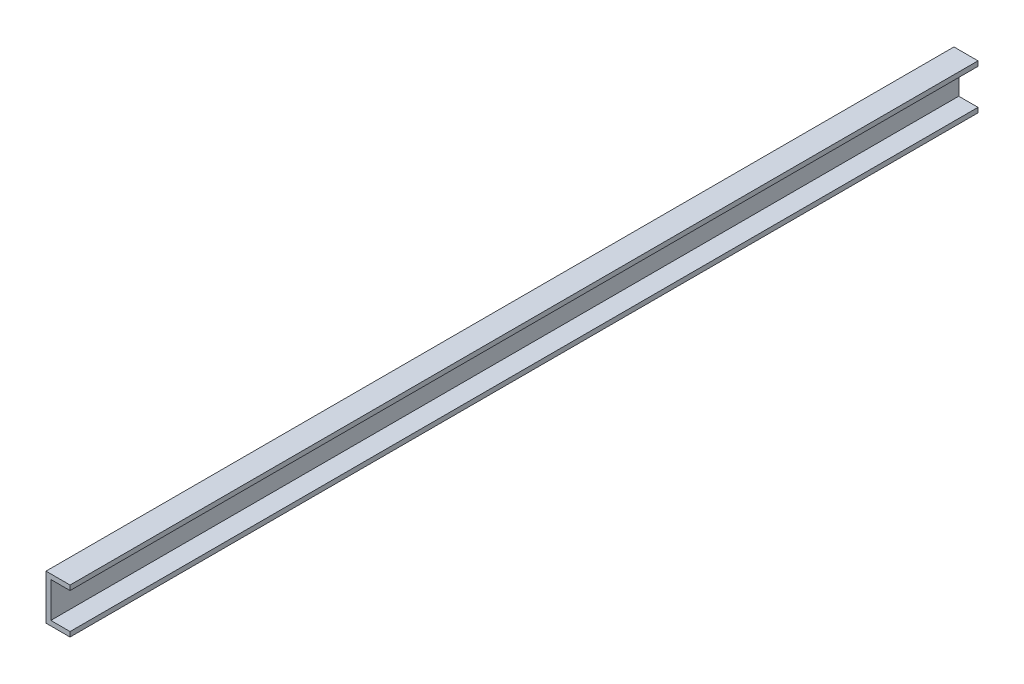
ISO-10303-21;
HEADER;
FILE_DESCRIPTION(('STEP AP214'),'2;1');
FILE_NAME('part.step','',(''),(''),'','','');
FILE_SCHEMA(('AUTOMOTIVE_DESIGN { 1 0 10303 214 1 1 1 1 }'));
ENDSEC;
DATA;
#1=APPLICATION_CONTEXT('core data for automotive mechanical design processes');
#2=APPLICATION_PROTOCOL_DEFINITION('international standard','automotive_design',2000,#1);
#3=PRODUCT_CONTEXT('',#1,'mechanical');
#4=PRODUCT('Part','Part','',(#3));
#5=PRODUCT_RELATED_PRODUCT_CATEGORY('part','',(#4));
#6=PRODUCT_DEFINITION_FORMATION('','',#4);
#7=PRODUCT_DEFINITION_CONTEXT('part definition',#1,'design');
#8=PRODUCT_DEFINITION('design','',#6,#7);
#9=PRODUCT_DEFINITION_SHAPE('','',#8);
#10=(LENGTH_UNIT() NAMED_UNIT(*) SI_UNIT(.MILLI.,.METRE.));
#11=(NAMED_UNIT(*) PLANE_ANGLE_UNIT() SI_UNIT($,.RADIAN.));
#12=(NAMED_UNIT(*) SI_UNIT($,.STERADIAN.) SOLID_ANGLE_UNIT());
#13=UNCERTAINTY_MEASURE_WITH_UNIT(LENGTH_MEASURE(1.E-05),#10,'distance_accuracy_value','');
#14=(GEOMETRIC_REPRESENTATION_CONTEXT(3) GLOBAL_UNCERTAINTY_ASSIGNED_CONTEXT((#13)) GLOBAL_UNIT_ASSIGNED_CONTEXT((#10,
#11,#12)) REPRESENTATION_CONTEXT('',''));
#15=CARTESIAN_POINT('',(0.,0.,0.));
#16=DIRECTION('',(0.,0.,1.));
#17=DIRECTION('',(1.,0.,0.));
#18=AXIS2_PLACEMENT_3D('',#15,#16,#17);
#19=CARTESIAN_POINT('',(40.,-37.5,-755.));
#20=DIRECTION('',(0.,1.,0.));
#21=DIRECTION('',(-1.,0.,0.));
#22=AXIS2_PLACEMENT_3D('',#19,#20,#21);
#23=PLANE('',#22);
#24=DIRECTION('',(-1.,0.,0.));
#25=VECTOR('',#24,1.);
#26=CARTESIAN_POINT('',(40.,-37.5,755.));
#27=LINE('',#26,#25);
#28=CARTESIAN_POINT('',(40.,-37.5,755.));
#29=VERTEX_POINT('',#28);
#30=CARTESIAN_POINT('',(0.,-37.5,755.));
#31=VERTEX_POINT('',#30);
#32=EDGE_CURVE('E164',#29,#31,#27,.T.);
#33=ORIENTED_EDGE('',*,*,#32,.T.);
#34=DIRECTION('',(0.,0.,1.));
#35=VECTOR('',#34,1.);
#36=CARTESIAN_POINT('',(0.,-37.5,-755.));
#37=LINE('',#36,#35);
#38=CARTESIAN_POINT('',(0.,-37.5,-755.));
#39=VERTEX_POINT('',#38);
#40=EDGE_CURVE('E13',#39,#31,#37,.T.);
#41=ORIENTED_EDGE('',*,*,#40,.F.);
#42=DIRECTION('',(-1.,0.,0.));
#43=VECTOR('',#42,1.);
#44=CARTESIAN_POINT('',(40.,-37.5,-755.));
#45=LINE('',#44,#43);
#46=CARTESIAN_POINT('',(40.,-37.5,-755.));
#47=VERTEX_POINT('',#46);
#48=EDGE_CURVE('E178',#47,#39,#45,.T.);
#49=ORIENTED_EDGE('',*,*,#48,.F.);
#50=DIRECTION('',(0.,0.,1.));
#51=VECTOR('',#50,1.);
#52=CARTESIAN_POINT('',(40.,-37.5,-755.));
#53=LINE('',#52,#51);
#54=EDGE_CURVE('E160',#47,#29,#53,.T.);
#55=ORIENTED_EDGE('',*,*,#54,.T.);
#56=EDGE_LOOP('',(#33,#41,#49,#55));
#57=FACE_BOUND('',#56,.T.);
#58=ADVANCED_FACE('F68',(#57),#23,.F.);
#59=CARTESIAN_POINT('',(0.,-37.5,-755.));
#60=DIRECTION('',(1.,0.,0.));
#61=DIRECTION('',(0.,0.,-1.));
#62=AXIS2_PLACEMENT_3D('',#59,#60,#61);
#63=PLANE('',#62);
#64=DIRECTION('',(0.,1.,0.));
#65=VECTOR('',#64,1.);
#66=CARTESIAN_POINT('',(0.,-37.5,755.));
#67=LINE('',#66,#65);
#68=CARTESIAN_POINT('',(0.,37.5,755.));
#69=VERTEX_POINT('',#68);
#70=EDGE_CURVE('E167',#31,#69,#67,.T.);
#71=ORIENTED_EDGE('',*,*,#70,.T.);
#72=DIRECTION('',(0.,0.,1.));
#73=VECTOR('',#72,1.);
#74=CARTESIAN_POINT('',(0.,37.5,-755.));
#75=LINE('',#74,#73);
#76=CARTESIAN_POINT('',(0.,37.5,-755.));
#77=VERTEX_POINT('',#76);
#78=EDGE_CURVE('E76',#77,#69,#75,.T.);
#79=ORIENTED_EDGE('',*,*,#78,.F.);
#80=DIRECTION('',(0.,1.,0.));
#81=VECTOR('',#80,1.);
#82=CARTESIAN_POINT('',(0.,-37.5,-755.));
#83=LINE('',#82,#81);
#84=EDGE_CURVE('E127',#39,#77,#83,.T.);
#85=ORIENTED_EDGE('',*,*,#84,.F.);
#86=ORIENTED_EDGE('',*,*,#40,.T.);
#87=EDGE_LOOP('',(#71,#79,#85,#86));
#88=FACE_BOUND('',#87,.T.);
#89=ADVANCED_FACE('F213',(#88),#63,.F.);
#90=CARTESIAN_POINT('',(0.,37.5,-755.));
#91=DIRECTION('',(0.,-1.,0.));
#92=DIRECTION('',(0.,0.,-1.));
#93=AXIS2_PLACEMENT_3D('',#90,#91,#92);
#94=PLANE('',#93);
#95=DIRECTION('',(1.,0.,0.));
#96=VECTOR('',#95,1.);
#97=CARTESIAN_POINT('',(0.,37.5,755.));
#98=LINE('',#97,#96);
#99=CARTESIAN_POINT('',(40.,37.5,755.));
#100=VERTEX_POINT('',#99);
#101=EDGE_CURVE('E169',#69,#100,#98,.T.);
#102=ORIENTED_EDGE('',*,*,#101,.T.);
#103=DIRECTION('',(0.,0.,1.));
#104=VECTOR('',#103,1.);
#105=CARTESIAN_POINT('',(40.,37.5,-755.));
#106=LINE('',#105,#104);
#107=CARTESIAN_POINT('',(40.,37.5,-755.));
#108=VERTEX_POINT('',#107);
#109=EDGE_CURVE('E185',#108,#100,#106,.T.);
#110=ORIENTED_EDGE('',*,*,#109,.F.);
#111=DIRECTION('',(1.,0.,0.));
#112=VECTOR('',#111,1.);
#113=CARTESIAN_POINT('',(0.,37.5,-755.));
#114=LINE('',#113,#112);
#115=EDGE_CURVE('E193',#77,#108,#114,.T.);
#116=ORIENTED_EDGE('',*,*,#115,.F.);
#117=ORIENTED_EDGE('',*,*,#78,.T.);
#118=EDGE_LOOP('',(#102,#110,#116,#117));
#119=FACE_BOUND('',#118,.T.);
#120=ADVANCED_FACE('F191',(#119),#94,.F.);
#121=CARTESIAN_POINT('',(40.,37.5,-755.));
#122=DIRECTION('',(-1.,0.,0.));
#123=DIRECTION('',(0.,-1.,0.));
#124=AXIS2_PLACEMENT_3D('',#121,#122,#123);
#125=PLANE('',#124);
#126=DIRECTION('',(0.,-1.,0.));
#127=VECTOR('',#126,1.);
#128=CARTESIAN_POINT('',(40.,37.5,755.));
#129=LINE('',#128,#127);
#130=CARTESIAN_POINT('',(40.,29.5,755.));
#131=VERTEX_POINT('',#130);
#132=EDGE_CURVE('E171',#100,#131,#129,.T.);
#133=ORIENTED_EDGE('',*,*,#132,.T.);
#134=DIRECTION('',(0.,0.,1.));
#135=VECTOR('',#134,1.);
#136=CARTESIAN_POINT('',(40.,29.5,-755.));
#137=LINE('',#136,#135);
#138=CARTESIAN_POINT('',(40.,29.5,-755.));
#139=VERTEX_POINT('',#138);
#140=EDGE_CURVE('E182',#139,#131,#137,.T.);
#141=ORIENTED_EDGE('',*,*,#140,.F.);
#142=DIRECTION('',(0.,-1.,0.));
#143=VECTOR('',#142,1.);
#144=CARTESIAN_POINT('',(40.,37.5,-755.));
#145=LINE('',#144,#143);
#146=EDGE_CURVE('E205',#108,#139,#145,.T.);
#147=ORIENTED_EDGE('',*,*,#146,.F.);
#148=ORIENTED_EDGE('',*,*,#109,.T.);
#149=EDGE_LOOP('',(#133,#141,#147,#148));
#150=FACE_BOUND('',#149,.T.);
#151=ADVANCED_FACE('F201',(#150),#125,.F.);
#152=CARTESIAN_POINT('',(40.,29.5,-755.));
#153=DIRECTION('',(0.,1.,0.));
#154=DIRECTION('',(-1.,0.,0.));
#155=AXIS2_PLACEMENT_3D('',#152,#153,#154);
#156=PLANE('',#155);
#157=DIRECTION('',(-1.,0.,0.));
#158=VECTOR('',#157,1.);
#159=CARTESIAN_POINT('',(40.,29.5,755.));
#160=LINE('',#159,#158);
#161=CARTESIAN_POINT('',(8.,29.5,755.));
#162=VERTEX_POINT('',#161);
#163=EDGE_CURVE('E173',#131,#162,#160,.T.);
#164=ORIENTED_EDGE('',*,*,#163,.T.);
#165=DIRECTION('',(0.,0.,1.));
#166=VECTOR('',#165,1.);
#167=CARTESIAN_POINT('',(8.,29.5,-755.));
#168=LINE('',#167,#166);
#169=CARTESIAN_POINT('',(8.,29.5,-755.));
#170=VERTEX_POINT('',#169);
#171=EDGE_CURVE('E155',#170,#162,#168,.T.);
#172=ORIENTED_EDGE('',*,*,#171,.F.);
#173=DIRECTION('',(-1.,0.,0.));
#174=VECTOR('',#173,1.);
#175=CARTESIAN_POINT('',(40.,29.5,-755.));
#176=LINE('',#175,#174);
#177=EDGE_CURVE('E146',#139,#170,#176,.T.);
#178=ORIENTED_EDGE('',*,*,#177,.F.);
#179=ORIENTED_EDGE('',*,*,#140,.T.);
#180=EDGE_LOOP('',(#164,#172,#178,#179));
#181=FACE_BOUND('',#180,.T.);
#182=ADVANCED_FACE('F204',(#181),#156,.F.);
#183=CARTESIAN_POINT('',(8.,29.5,-755.));
#184=DIRECTION('',(-1.,0.,0.));
#185=DIRECTION('',(0.,-1.,0.));
#186=AXIS2_PLACEMENT_3D('',#183,#184,#185);
#187=PLANE('',#186);
#188=DIRECTION('',(0.,-1.,0.));
#189=VECTOR('',#188,1.);
#190=CARTESIAN_POINT('',(8.,29.5,755.));
#191=LINE('',#190,#189);
#192=CARTESIAN_POINT('',(8.00000000000001,-29.5,755.));
#193=VERTEX_POINT('',#192);
#194=EDGE_CURVE('E154',#162,#193,#191,.T.);
#195=ORIENTED_EDGE('',*,*,#194,.T.);
#196=DIRECTION('',(0.,0.,1.));
#197=VECTOR('',#196,1.);
#198=CARTESIAN_POINT('',(8.00000000000001,-29.5,-755.));
#199=LINE('',#198,#197);
#200=CARTESIAN_POINT('',(8.00000000000001,-29.5,-755.));
#201=VERTEX_POINT('',#200);
#202=EDGE_CURVE('E151',#201,#193,#199,.T.);
#203=ORIENTED_EDGE('',*,*,#202,.F.);
#204=DIRECTION('',(0.,-1.,0.));
#205=VECTOR('',#204,1.);
#206=CARTESIAN_POINT('',(8.,29.5,-755.));
#207=LINE('',#206,#205);
#208=EDGE_CURVE('E140',#170,#201,#207,.T.);
#209=ORIENTED_EDGE('',*,*,#208,.F.);
#210=ORIENTED_EDGE('',*,*,#171,.T.);
#211=EDGE_LOOP('',(#195,#203,#209,#210));
#212=FACE_BOUND('',#211,.T.);
#213=ADVANCED_FACE('F152',(#212),#187,.F.);
#214=CARTESIAN_POINT('',(8.00000000000001,-29.5,-755.));
#215=DIRECTION('',(0.,-1.,0.));
#216=DIRECTION('',(0.,0.,-1.));
#217=AXIS2_PLACEMENT_3D('',#214,#215,#216);
#218=PLANE('',#217);
#219=DIRECTION('',(1.,0.,0.));
#220=VECTOR('',#219,1.);
#221=CARTESIAN_POINT('',(8.00000000000001,-29.5,755.));
#222=LINE('',#221,#220);
#223=CARTESIAN_POINT('',(40.,-29.5,755.));
#224=VERTEX_POINT('',#223);
#225=EDGE_CURVE('E113',#193,#224,#222,.T.);
#226=ORIENTED_EDGE('',*,*,#225,.T.);
#227=DIRECTION('',(0.,0.,1.));
#228=VECTOR('',#227,1.);
#229=CARTESIAN_POINT('',(40.,-29.5,-755.));
#230=LINE('',#229,#228);
#231=CARTESIAN_POINT('',(40.,-29.5,-755.));
#232=VERTEX_POINT('',#231);
#233=EDGE_CURVE('E156',#232,#224,#230,.T.);
#234=ORIENTED_EDGE('',*,*,#233,.F.);
#235=DIRECTION('',(1.,0.,0.));
#236=VECTOR('',#235,1.);
#237=CARTESIAN_POINT('',(8.00000000000001,-29.5,-755.));
#238=LINE('',#237,#236);
#239=EDGE_CURVE('E144',#201,#232,#238,.T.);
#240=ORIENTED_EDGE('',*,*,#239,.F.);
#241=ORIENTED_EDGE('',*,*,#202,.T.);
#242=EDGE_LOOP('',(#226,#234,#240,#241));
#243=FACE_BOUND('',#242,.T.);
#244=ADVANCED_FACE('F158',(#243),#218,.F.);
#245=CARTESIAN_POINT('',(40.,-29.5,-755.));
#246=DIRECTION('',(-1.,0.,0.));
#247=DIRECTION('',(0.,-1.,0.));
#248=AXIS2_PLACEMENT_3D('',#245,#246,#247);
#249=PLANE('',#248);
#250=DIRECTION('',(0.,-1.,0.));
#251=VECTOR('',#250,1.);
#252=CARTESIAN_POINT('',(40.,-29.5,755.));
#253=LINE('',#252,#251);
#254=EDGE_CURVE('E119',#224,#29,#253,.T.);
#255=ORIENTED_EDGE('',*,*,#254,.T.);
#256=ORIENTED_EDGE('',*,*,#54,.F.);
#257=DIRECTION('',(0.,-1.,0.));
#258=VECTOR('',#257,1.);
#259=CARTESIAN_POINT('',(40.,-29.5,-755.));
#260=LINE('',#259,#258);
#261=EDGE_CURVE('E84',#232,#47,#260,.T.);
#262=ORIENTED_EDGE('',*,*,#261,.F.);
#263=ORIENTED_EDGE('',*,*,#233,.T.);
#264=EDGE_LOOP('',(#255,#256,#262,#263));
#265=FACE_BOUND('',#264,.T.);
#266=ADVANCED_FACE('F229',(#265),#249,.F.);
#267=CARTESIAN_POINT('',(0.,0.,-755.));
#268=DIRECTION('',(0.,0.,-1.));
#269=DIRECTION('',(-1.,0.,0.));
#270=AXIS2_PLACEMENT_3D('',#267,#268,#269);
#271=PLANE('',#270);
#272=ORIENTED_EDGE('',*,*,#48,.T.);
#273=ORIENTED_EDGE('',*,*,#84,.T.);
#274=ORIENTED_EDGE('',*,*,#115,.T.);
#275=ORIENTED_EDGE('',*,*,#146,.T.);
#276=ORIENTED_EDGE('',*,*,#177,.T.);
#277=ORIENTED_EDGE('',*,*,#208,.T.);
#278=ORIENTED_EDGE('',*,*,#239,.T.);
#279=ORIENTED_EDGE('',*,*,#261,.T.);
#280=EDGE_LOOP('',(#272,#273,#274,#275,#276,#277,#278,#279));
#281=FACE_BOUND('',#280,.T.);
#282=ADVANCED_FACE('F142',(#281),#271,.T.);
#283=CARTESIAN_POINT('',(0.,0.,755.));
#284=DIRECTION('',(0.,0.,-1.));
#285=DIRECTION('',(-1.,0.,0.));
#286=AXIS2_PLACEMENT_3D('',#283,#284,#285);
#287=PLANE('',#286);
#288=ORIENTED_EDGE('',*,*,#32,.F.);
#289=ORIENTED_EDGE('',*,*,#254,.F.);
#290=ORIENTED_EDGE('',*,*,#225,.F.);
#291=ORIENTED_EDGE('',*,*,#194,.F.);
#292=ORIENTED_EDGE('',*,*,#163,.F.);
#293=ORIENTED_EDGE('',*,*,#132,.F.);
#294=ORIENTED_EDGE('',*,*,#101,.F.);
#295=ORIENTED_EDGE('',*,*,#70,.F.);
#296=EDGE_LOOP('',(#288,#289,#290,#291,#292,#293,#294,#295));
#297=FACE_BOUND('',#296,.T.);
#298=ADVANCED_FACE('F197',(#297),#287,.F.);
#299=CLOSED_SHELL('',(#58,#89,#120,#151,#182,#213,#244,#266,#282,#298));
#300=MANIFOLD_SOLID_BREP('B2',#299);
#301=ADVANCED_BREP_SHAPE_REPRESENTATION('',(#18,#300),#14);
#302=SHAPE_DEFINITION_REPRESENTATION(#9,#301);
ENDSEC;
END-ISO-10303-21;
